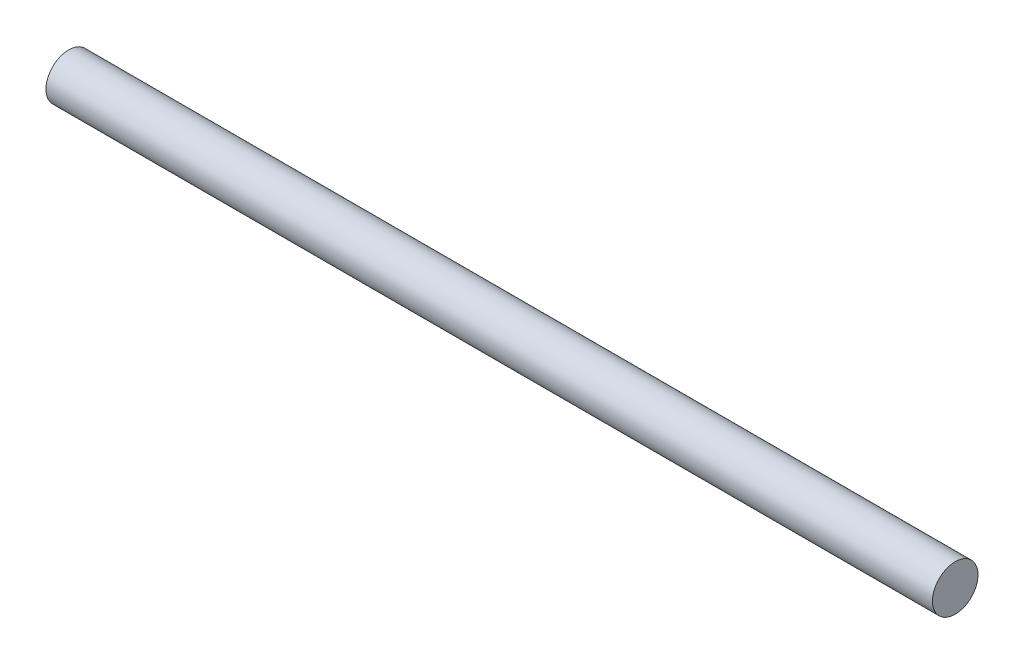
ISO-10303-21;
HEADER;
FILE_DESCRIPTION(('STEP AP214'),'2;1');
FILE_NAME('part.step','',(''),(''),'','','');
FILE_SCHEMA(('AUTOMOTIVE_DESIGN { 1 0 10303 214 1 1 1 1 }'));
ENDSEC;
DATA;
#1=APPLICATION_CONTEXT('core data for automotive mechanical design processes');
#2=APPLICATION_PROTOCOL_DEFINITION('international standard','automotive_design',2000,#1);
#3=PRODUCT_CONTEXT('',#1,'mechanical');
#4=PRODUCT('Part','Part','',(#3));
#5=PRODUCT_RELATED_PRODUCT_CATEGORY('part','',(#4));
#6=PRODUCT_DEFINITION_FORMATION('','',#4);
#7=PRODUCT_DEFINITION_CONTEXT('part definition',#1,'design');
#8=PRODUCT_DEFINITION('design','',#6,#7);
#9=PRODUCT_DEFINITION_SHAPE('','',#8);
#10=(LENGTH_UNIT() NAMED_UNIT(*) SI_UNIT(.MILLI.,.METRE.));
#11=(NAMED_UNIT(*) PLANE_ANGLE_UNIT() SI_UNIT($,.RADIAN.));
#12=(NAMED_UNIT(*) SI_UNIT($,.STERADIAN.) SOLID_ANGLE_UNIT());
#13=UNCERTAINTY_MEASURE_WITH_UNIT(LENGTH_MEASURE(1.E-05),#10,'distance_accuracy_value','');
#14=(GEOMETRIC_REPRESENTATION_CONTEXT(3) GLOBAL_UNCERTAINTY_ASSIGNED_CONTEXT((#13)) GLOBAL_UNIT_ASSIGNED_CONTEXT((#10,
#11,#12)) REPRESENTATION_CONTEXT('',''));
#15=CARTESIAN_POINT('',(0.,0.,0.));
#16=DIRECTION('',(0.,0.,1.));
#17=DIRECTION('',(1.,0.,0.));
#18=AXIS2_PLACEMENT_3D('',#15,#16,#17);
#19=CARTESIAN_POINT('',(11.37,0.,0.));
#20=DIRECTION('',(-1.,0.,0.));
#21=DIRECTION('',(0.,0.,1.));
#22=AXIS2_PLACEMENT_3D('',#19,#20,#21);
#23=CYLINDRICAL_SURFACE('',#22,0.2921);
#24=CARTESIAN_POINT('',(11.37,0.,0.));
#25=DIRECTION('',(1.,0.,0.));
#26=DIRECTION('',(0.,0.,-1.));
#27=AXIS2_PLACEMENT_3D('',#24,#25,#26);
#28=CIRCLE('',#27,0.2921);
#29=CARTESIAN_POINT('',(11.37,0.,-0.2921));
#30=VERTEX_POINT('',#29);
#31=EDGE_CURVE('E10',#30,#30,#28,.T.);
#32=ORIENTED_EDGE('',*,*,#31,.F.);
#33=EDGE_LOOP('',(#32));
#34=FACE_BOUND('',#33,.T.);
#35=CARTESIAN_POINT('',(0.,0.,0.));
#36=DIRECTION('',(1.,0.,0.));
#37=DIRECTION('',(0.,0.,-1.));
#38=AXIS2_PLACEMENT_3D('',#35,#36,#37);
#39=CIRCLE('',#38,0.2921);
#40=CARTESIAN_POINT('',(0.,0.,-0.2921));
#41=VERTEX_POINT('',#40);
#42=EDGE_CURVE('E34',#41,#41,#39,.T.);
#43=ORIENTED_EDGE('',*,*,#42,.T.);
#44=EDGE_LOOP('',(#43));
#45=FACE_BOUND('',#44,.T.);
#46=ADVANCED_FACE('F31',(#34,#45),#23,.T.);
#47=CARTESIAN_POINT('',(11.37,0.,0.));
#48=DIRECTION('',(1.,0.,0.));
#49=DIRECTION('',(0.,0.,-1.));
#50=AXIS2_PLACEMENT_3D('',#47,#48,#49);
#51=PLANE('',#50);
#52=ORIENTED_EDGE('',*,*,#31,.T.);
#53=EDGE_LOOP('',(#52));
#54=FACE_BOUND('',#53,.T.);
#55=ADVANCED_FACE('F46',(#54),#51,.T.);
#56=CARTESIAN_POINT('',(0.,0.,0.));
#57=DIRECTION('',(1.,0.,0.));
#58=DIRECTION('',(0.,0.,-1.));
#59=AXIS2_PLACEMENT_3D('',#56,#57,#58);
#60=PLANE('',#59);
#61=ORIENTED_EDGE('',*,*,#42,.F.);
#62=EDGE_LOOP('',(#61));
#63=FACE_BOUND('',#62,.T.);
#64=ADVANCED_FACE('F44',(#63),#60,.F.);
#65=CLOSED_SHELL('',(#46,#55,#64));
#66=MANIFOLD_SOLID_BREP('B2',#65);
#67=ADVANCED_BREP_SHAPE_REPRESENTATION('',(#18,#66),#14);
#68=SHAPE_DEFINITION_REPRESENTATION(#9,#67);
ENDSEC;
END-ISO-10303-21;
